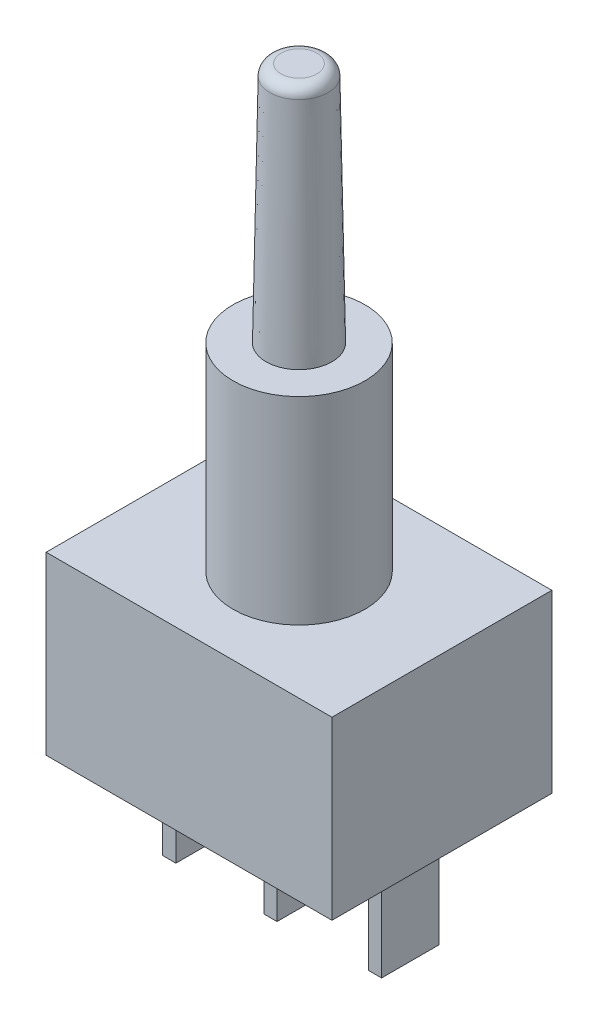
ISO-10303-21;
HEADER;
FILE_DESCRIPTION(('STEP AP214'),'2;1');
FILE_NAME('part.step','',(''),(''),'','','');
FILE_SCHEMA(('AUTOMOTIVE_DESIGN { 1 0 10303 214 1 1 1 1 }'));
ENDSEC;
DATA;
#1=APPLICATION_CONTEXT('core data for automotive mechanical design processes');
#2=APPLICATION_PROTOCOL_DEFINITION('international standard','automotive_design',2000,#1);
#3=PRODUCT_CONTEXT('',#1,'mechanical');
#4=PRODUCT('Part','Part','',(#3));
#5=PRODUCT_RELATED_PRODUCT_CATEGORY('part','',(#4));
#6=PRODUCT_DEFINITION_FORMATION('','',#4);
#7=PRODUCT_DEFINITION_CONTEXT('part definition',#1,'design');
#8=PRODUCT_DEFINITION('design','',#6,#7);
#9=PRODUCT_DEFINITION_SHAPE('','',#8);
#10=(LENGTH_UNIT() NAMED_UNIT(*) SI_UNIT(.MILLI.,.METRE.));
#11=(NAMED_UNIT(*) PLANE_ANGLE_UNIT() SI_UNIT($,.RADIAN.));
#12=(NAMED_UNIT(*) SI_UNIT($,.STERADIAN.) SOLID_ANGLE_UNIT());
#13=UNCERTAINTY_MEASURE_WITH_UNIT(LENGTH_MEASURE(1.E-05),#10,'distance_accuracy_value','');
#14=(GEOMETRIC_REPRESENTATION_CONTEXT(3) GLOBAL_UNCERTAINTY_ASSIGNED_CONTEXT((#13)) GLOBAL_UNIT_ASSIGNED_CONTEXT((#10,
#11,#12)) REPRESENTATION_CONTEXT('',''));
#15=CARTESIAN_POINT('',(0.,0.,0.));
#16=DIRECTION('',(0.,0.,1.));
#17=DIRECTION('',(1.,0.,0.));
#18=AXIS2_PLACEMENT_3D('',#15,#16,#17);
#19=CARTESIAN_POINT('',(0.,0.,0.));
#20=DIRECTION('',(0.,1.,0.));
#21=DIRECTION('',(0.,0.,1.));
#22=AXIS2_PLACEMENT_3D('',#19,#20,#21);
#23=PLANE('',#22);
#24=DIRECTION('',(0.,0.,1.));
#25=VECTOR('',#24,1.);
#26=CARTESIAN_POINT('',(0.3,0.,1.3));
#27=LINE('',#26,#25);
#28=CARTESIAN_POINT('',(0.3,0.,-1.3));
#29=VERTEX_POINT('',#28);
#30=CARTESIAN_POINT('',(0.3,0.,1.3));
#31=VERTEX_POINT('',#30);
#32=EDGE_CURVE('E173',#29,#31,#27,.T.);
#33=ORIENTED_EDGE('',*,*,#32,.F.);
#34=DIRECTION('',(1.,0.,0.));
#35=VECTOR('',#34,1.);
#36=CARTESIAN_POINT('',(-0.3,0.,-1.3));
#37=LINE('',#36,#35);
#38=CARTESIAN_POINT('',(-0.3,0.,-1.3));
#39=VERTEX_POINT('',#38);
#40=EDGE_CURVE('E186',#39,#29,#37,.T.);
#41=ORIENTED_EDGE('',*,*,#40,.F.);
#42=DIRECTION('',(0.,0.,-1.));
#43=VECTOR('',#42,1.);
#44=CARTESIAN_POINT('',(-0.3,0.,1.3));
#45=LINE('',#44,#43);
#46=CARTESIAN_POINT('',(-0.3,0.,1.3));
#47=VERTEX_POINT('',#46);
#48=EDGE_CURVE('E195',#47,#39,#45,.T.);
#49=ORIENTED_EDGE('',*,*,#48,.F.);
#50=DIRECTION('',(-1.,0.,0.));
#51=VECTOR('',#50,1.);
#52=CARTESIAN_POINT('',(-0.3,0.,1.3));
#53=LINE('',#52,#51);
#54=EDGE_CURVE('E176',#31,#47,#53,.T.);
#55=ORIENTED_EDGE('',*,*,#54,.F.);
#56=EDGE_LOOP('',(#33,#41,#49,#55));
#57=FACE_BOUND('',#56,.T.);
#58=DIRECTION('',(0.,0.,-1.));
#59=VECTOR('',#58,1.);
#60=CARTESIAN_POINT('',(6.5,0.,-5.));
#61=LINE('',#60,#59);
#62=CARTESIAN_POINT('',(6.5,0.,5.));
#63=VERTEX_POINT('',#62);
#64=CARTESIAN_POINT('',(6.5,0.,-5.));
#65=VERTEX_POINT('',#64);
#66=EDGE_CURVE('E251',#63,#65,#61,.T.);
#67=ORIENTED_EDGE('',*,*,#66,.F.);
#68=DIRECTION('',(1.,0.,0.));
#69=VECTOR('',#68,1.);
#70=CARTESIAN_POINT('',(-6.5,0.,5.));
#71=LINE('',#70,#69);
#72=CARTESIAN_POINT('',(-6.5,0.,5.));
#73=VERTEX_POINT('',#72);
#74=EDGE_CURVE('E259',#73,#63,#71,.T.);
#75=ORIENTED_EDGE('',*,*,#74,.F.);
#76=DIRECTION('',(0.,0.,1.));
#77=VECTOR('',#76,1.);
#78=CARTESIAN_POINT('',(-6.5,0.,-5.));
#79=LINE('',#78,#77);
#80=CARTESIAN_POINT('',(-6.5,0.,-5.));
#81=VERTEX_POINT('',#80);
#82=EDGE_CURVE('E270',#81,#73,#79,.T.);
#83=ORIENTED_EDGE('',*,*,#82,.F.);
#84=DIRECTION('',(-1.,0.,0.));
#85=VECTOR('',#84,1.);
#86=CARTESIAN_POINT('',(-6.5,0.,-5.));
#87=LINE('',#86,#85);
#88=EDGE_CURVE('E268',#65,#81,#87,.T.);
#89=ORIENTED_EDGE('',*,*,#88,.F.);
#90=EDGE_LOOP('',(#67,#75,#83,#89));
#91=FACE_BOUND('',#90,.T.);
#92=DIRECTION('',(0.,0.,1.));
#93=VECTOR('',#92,1.);
#94=CARTESIAN_POINT('',(-4.3,0.,1.3));
#95=LINE('',#94,#93);
#96=CARTESIAN_POINT('',(-4.3,0.,-1.3));
#97=VERTEX_POINT('',#96);
#98=CARTESIAN_POINT('',(-4.3,0.,1.3));
#99=VERTEX_POINT('',#98);
#100=EDGE_CURVE('E211',#97,#99,#95,.T.);
#101=ORIENTED_EDGE('',*,*,#100,.F.);
#102=DIRECTION('',(1.,0.,0.));
#103=VECTOR('',#102,1.);
#104=CARTESIAN_POINT('',(-4.9,0.,-1.3));
#105=LINE('',#104,#103);
#106=CARTESIAN_POINT('',(-4.9,0.,-1.3));
#107=VERTEX_POINT('',#106);
#108=EDGE_CURVE('E216',#107,#97,#105,.T.);
#109=ORIENTED_EDGE('',*,*,#108,.F.);
#110=DIRECTION('',(0.,0.,-1.));
#111=VECTOR('',#110,1.);
#112=CARTESIAN_POINT('',(-4.9,0.,1.3));
#113=LINE('',#112,#111);
#114=CARTESIAN_POINT('',(-4.9,0.,1.3));
#115=VERTEX_POINT('',#114);
#116=EDGE_CURVE('E228',#115,#107,#113,.T.);
#117=ORIENTED_EDGE('',*,*,#116,.F.);
#118=DIRECTION('',(-1.,0.,0.));
#119=VECTOR('',#118,1.);
#120=CARTESIAN_POINT('',(-4.9,0.,1.3));
#121=LINE('',#120,#119);
#122=EDGE_CURVE('E225',#99,#115,#121,.T.);
#123=ORIENTED_EDGE('',*,*,#122,.F.);
#124=EDGE_LOOP('',(#101,#109,#117,#123));
#125=FACE_BOUND('',#124,.T.);
#126=DIRECTION('',(0.,0.,1.));
#127=VECTOR('',#126,1.);
#128=CARTESIAN_POINT('',(4.9,0.,1.14348945082824));
#129=LINE('',#128,#127);
#130=CARTESIAN_POINT('',(4.9,0.,-1.45651054917176));
#131=VERTEX_POINT('',#130);
#132=CARTESIAN_POINT('',(4.9,0.,1.14348945082824));
#133=VERTEX_POINT('',#132);
#134=EDGE_CURVE('E172',#131,#133,#129,.T.);
#135=ORIENTED_EDGE('',*,*,#134,.F.);
#136=DIRECTION('',(1.,0.,0.));
#137=VECTOR('',#136,1.);
#138=CARTESIAN_POINT('',(4.3,0.,-1.45651054917176));
#139=LINE('',#138,#137);
#140=CARTESIAN_POINT('',(4.3,0.,-1.45651054917176));
#141=VERTEX_POINT('',#140);
#142=EDGE_CURVE('E169',#141,#131,#139,.T.);
#143=ORIENTED_EDGE('',*,*,#142,.F.);
#144=DIRECTION('',(0.,0.,-1.));
#145=VECTOR('',#144,1.);
#146=CARTESIAN_POINT('',(4.3,0.,1.14348945082824));
#147=LINE('',#146,#145);
#148=CARTESIAN_POINT('',(4.3,0.,1.14348945082824));
#149=VERTEX_POINT('',#148);
#150=EDGE_CURVE('E59',#149,#141,#147,.T.);
#151=ORIENTED_EDGE('',*,*,#150,.F.);
#152=DIRECTION('',(-1.,0.,0.));
#153=VECTOR('',#152,1.);
#154=CARTESIAN_POINT('',(4.3,0.,1.14348945082824));
#155=LINE('',#154,#153);
#156=EDGE_CURVE('E54',#133,#149,#155,.T.);
#157=ORIENTED_EDGE('',*,*,#156,.F.);
#158=EDGE_LOOP('',(#135,#143,#151,#157));
#159=FACE_BOUND('',#158,.T.);
#160=ADVANCED_FACE('F39',(#57,#91,#125,#159),#23,.F.);
#161=CARTESIAN_POINT('',(6.5,8.,-5.));
#162=DIRECTION('',(-1.,0.,0.));
#163=DIRECTION('',(0.,0.,1.));
#164=AXIS2_PLACEMENT_3D('',#161,#162,#163);
#165=PLANE('',#164);
#166=ORIENTED_EDGE('',*,*,#66,.T.);
#167=DIRECTION('',(0.,-1.,0.));
#168=VECTOR('',#167,1.);
#169=CARTESIAN_POINT('',(6.5,8.,-5.));
#170=LINE('',#169,#168);
#171=CARTESIAN_POINT('',(6.5,8.,-5.));
#172=VERTEX_POINT('',#171);
#173=EDGE_CURVE('E254',#172,#65,#170,.T.);
#174=ORIENTED_EDGE('',*,*,#173,.F.);
#175=DIRECTION('',(0.,0.,-1.));
#176=VECTOR('',#175,1.);
#177=CARTESIAN_POINT('',(6.5,8.,-5.));
#178=LINE('',#177,#176);
#179=CARTESIAN_POINT('',(6.5,8.,5.));
#180=VERTEX_POINT('',#179);
#181=EDGE_CURVE('E255',#180,#172,#178,.T.);
#182=ORIENTED_EDGE('',*,*,#181,.F.);
#183=DIRECTION('',(0.,-1.,0.));
#184=VECTOR('',#183,1.);
#185=CARTESIAN_POINT('',(6.5,8.,5.));
#186=LINE('',#185,#184);
#187=EDGE_CURVE('E265',#180,#63,#186,.T.);
#188=ORIENTED_EDGE('',*,*,#187,.T.);
#189=EDGE_LOOP('',(#166,#174,#182,#188));
#190=FACE_BOUND('',#189,.T.);
#191=ADVANCED_FACE('F301',(#190),#165,.F.);
#192=CARTESIAN_POINT('',(-6.5,8.,-5.));
#193=DIRECTION('',(0.,0.,1.));
#194=DIRECTION('',(1.,0.,0.));
#195=AXIS2_PLACEMENT_3D('',#192,#193,#194);
#196=PLANE('',#195);
#197=ORIENTED_EDGE('',*,*,#88,.T.);
#198=DIRECTION('',(0.,-1.,0.));
#199=VECTOR('',#198,1.);
#200=CARTESIAN_POINT('',(-6.5,8.,-5.));
#201=LINE('',#200,#199);
#202=CARTESIAN_POINT('',(-6.5,8.,-5.));
#203=VERTEX_POINT('',#202);
#204=EDGE_CURVE('E278',#203,#81,#201,.T.);
#205=ORIENTED_EDGE('',*,*,#204,.F.);
#206=DIRECTION('',(-1.,0.,0.));
#207=VECTOR('',#206,1.);
#208=CARTESIAN_POINT('',(-6.5,8.,-5.));
#209=LINE('',#208,#207);
#210=EDGE_CURVE('E258',#172,#203,#209,.T.);
#211=ORIENTED_EDGE('',*,*,#210,.F.);
#212=ORIENTED_EDGE('',*,*,#173,.T.);
#213=EDGE_LOOP('',(#197,#205,#211,#212));
#214=FACE_BOUND('',#213,.T.);
#215=ADVANCED_FACE('F307',(#214),#196,.F.);
#216=CARTESIAN_POINT('',(-6.5,8.,-5.));
#217=DIRECTION('',(1.,0.,0.));
#218=DIRECTION('',(0.,0.,-1.));
#219=AXIS2_PLACEMENT_3D('',#216,#217,#218);
#220=PLANE('',#219);
#221=ORIENTED_EDGE('',*,*,#82,.T.);
#222=DIRECTION('',(0.,-1.,0.));
#223=VECTOR('',#222,1.);
#224=CARTESIAN_POINT('',(-6.5,8.,5.));
#225=LINE('',#224,#223);
#226=CARTESIAN_POINT('',(-6.5,8.,5.));
#227=VERTEX_POINT('',#226);
#228=EDGE_CURVE('E275',#227,#73,#225,.T.);
#229=ORIENTED_EDGE('',*,*,#228,.F.);
#230=DIRECTION('',(0.,0.,1.));
#231=VECTOR('',#230,1.);
#232=CARTESIAN_POINT('',(-6.5,8.,-5.));
#233=LINE('',#232,#231);
#234=EDGE_CURVE('E261',#203,#227,#233,.T.);
#235=ORIENTED_EDGE('',*,*,#234,.F.);
#236=ORIENTED_EDGE('',*,*,#204,.T.);
#237=EDGE_LOOP('',(#221,#229,#235,#236));
#238=FACE_BOUND('',#237,.T.);
#239=ADVANCED_FACE('F317',(#238),#220,.F.);
#240=CARTESIAN_POINT('',(-6.5,8.,5.));
#241=DIRECTION('',(0.,0.,-1.));
#242=DIRECTION('',(-1.,0.,0.));
#243=AXIS2_PLACEMENT_3D('',#240,#241,#242);
#244=PLANE('',#243);
#245=ORIENTED_EDGE('',*,*,#74,.T.);
#246=ORIENTED_EDGE('',*,*,#187,.F.);
#247=DIRECTION('',(1.,0.,0.));
#248=VECTOR('',#247,1.);
#249=CARTESIAN_POINT('',(-6.5,8.,5.));
#250=LINE('',#249,#248);
#251=EDGE_CURVE('E263',#227,#180,#250,.T.);
#252=ORIENTED_EDGE('',*,*,#251,.F.);
#253=ORIENTED_EDGE('',*,*,#228,.T.);
#254=EDGE_LOOP('',(#245,#246,#252,#253));
#255=FACE_BOUND('',#254,.T.);
#256=ADVANCED_FACE('F314',(#255),#244,.F.);
#257=CARTESIAN_POINT('',(0.,8.,0.));
#258=DIRECTION('',(0.,1.,0.));
#259=DIRECTION('',(0.,0.,1.));
#260=AXIS2_PLACEMENT_3D('',#257,#258,#259);
#261=PLANE('',#260);
#262=CARTESIAN_POINT('',(0.,8.,0.));
#263=DIRECTION('',(0.,1.,0.));
#264=DIRECTION('',(0.,0.,1.));
#265=AXIS2_PLACEMENT_3D('',#262,#263,#264);
#266=CIRCLE('',#265,3.);
#267=CARTESIAN_POINT('',(0.,8.,3.));
#268=VERTEX_POINT('',#267);
#269=EDGE_CURVE('E248',#268,#268,#266,.T.);
#270=ORIENTED_EDGE('',*,*,#269,.F.);
#271=EDGE_LOOP('',(#270));
#272=FACE_BOUND('',#271,.T.);
#273=ORIENTED_EDGE('',*,*,#181,.T.);
#274=ORIENTED_EDGE('',*,*,#210,.T.);
#275=ORIENTED_EDGE('',*,*,#234,.T.);
#276=ORIENTED_EDGE('',*,*,#251,.T.);
#277=EDGE_LOOP('',(#273,#274,#275,#276));
#278=FACE_BOUND('',#277,.T.);
#279=ADVANCED_FACE('F312',(#272,#278),#261,.T.);
#280=CARTESIAN_POINT('',(0.,17.,0.));
#281=DIRECTION('',(0.,-1.,0.));
#282=DIRECTION('',(0.,0.,-1.));
#283=AXIS2_PLACEMENT_3D('',#280,#281,#282);
#284=CYLINDRICAL_SURFACE('',#283,3.);
#285=CARTESIAN_POINT('',(0.,17.,0.));
#286=DIRECTION('',(0.,1.,0.));
#287=DIRECTION('',(0.,0.,1.));
#288=AXIS2_PLACEMENT_3D('',#285,#286,#287);
#289=CIRCLE('',#288,3.);
#290=CARTESIAN_POINT('',(0.,17.,3.));
#291=VERTEX_POINT('',#290);
#292=EDGE_CURVE('E244',#291,#291,#289,.T.);
#293=ORIENTED_EDGE('',*,*,#292,.F.);
#294=EDGE_LOOP('',(#293));
#295=FACE_BOUND('',#294,.T.);
#296=ORIENTED_EDGE('',*,*,#269,.T.);
#297=EDGE_LOOP('',(#296));
#298=FACE_BOUND('',#297,.T.);
#299=ADVANCED_FACE('F339',(#295,#298),#284,.T.);
#300=CARTESIAN_POINT('',(0.,17.,0.));
#301=DIRECTION('',(0.,1.,0.));
#302=DIRECTION('',(0.,0.,1.));
#303=AXIS2_PLACEMENT_3D('',#300,#301,#302);
#304=PLANE('',#303);
#305=CARTESIAN_POINT('',(0.,17.,0.));
#306=DIRECTION('',(0.,1.,0.));
#307=DIRECTION('',(0.,0.,1.));
#308=AXIS2_PLACEMENT_3D('',#305,#306,#307);
#309=CIRCLE('',#308,1.5);
#310=CARTESIAN_POINT('',(0.,17.,1.5));
#311=VERTEX_POINT('',#310);
#312=EDGE_CURVE('E245',#311,#311,#309,.T.);
#313=ORIENTED_EDGE('',*,*,#312,.F.);
#314=EDGE_LOOP('',(#313));
#315=FACE_BOUND('',#314,.T.);
#316=ORIENTED_EDGE('',*,*,#292,.T.);
#317=EDGE_LOOP('',(#316));
#318=FACE_BOUND('',#317,.T.);
#319=ADVANCED_FACE('F344',(#315,#318),#304,.T.);
#320=CARTESIAN_POINT('',(0.,17.,0.));
#321=DIRECTION('',(0.,-1.,0.));
#322=DIRECTION('',(0.,0.,1.));
#323=AXIS2_PLACEMENT_3D('',#320,#321,#322);
#324=CONICAL_SURFACE('',#323,1.5,0.0174532925199433);
#325=CARTESIAN_POINT('',(0.,27.5087262032186,0.));
#326=DIRECTION('',(0.,-1.,0.));
#327=DIRECTION('',(0.,0.,-1.));
#328=AXIS2_PLACEMENT_3D('',#325,#326,#327);
#329=CIRCLE('',#328,1.31656950180996);
#330=CARTESIAN_POINT('',(0.,27.5087262032186,-1.31656950180996));
#331=VERTEX_POINT('',#330);
#332=EDGE_CURVE('E11',#331,#331,#329,.T.);
#333=ORIENTED_EDGE('',*,*,#332,.T.);
#334=EDGE_LOOP('',(#333));
#335=FACE_BOUND('',#334,.T.);
#336=ORIENTED_EDGE('',*,*,#312,.T.);
#337=EDGE_LOOP('',(#336));
#338=FACE_BOUND('',#337,.T.);
#339=ADVANCED_FACE('F297',(#335,#338),#324,.T.);
#340=CARTESIAN_POINT('',(0.,28.,0.));
#341=DIRECTION('',(0.,1.,0.));
#342=DIRECTION('',(0.,0.,1.));
#343=AXIS2_PLACEMENT_3D('',#340,#341,#342);
#344=PLANE('',#343);
#345=CARTESIAN_POINT('',(0.,28.,0.));
#346=DIRECTION('',(0.,1.,0.));
#347=DIRECTION('',(0.,0.,1.));
#348=AXIS2_PLACEMENT_3D('',#345,#346,#347);
#349=CIRCLE('',#348,0.816645654231762);
#350=CARTESIAN_POINT('',(0.,28.,0.816645654231762));
#351=VERTEX_POINT('',#350);
#352=EDGE_CURVE('E47',#351,#351,#349,.T.);
#353=ORIENTED_EDGE('',*,*,#352,.T.);
#354=EDGE_LOOP('',(#353));
#355=FACE_BOUND('',#354,.T.);
#356=ADVANCED_FACE('F285',(#355),#344,.T.);
#357=CARTESIAN_POINT('',(0.,27.5,0.));
#358=DIRECTION('',(0.,1.,0.));
#359=DIRECTION('',(0.,0.,1.));
#360=AXIS2_PLACEMENT_3D('',#357,#358,#359);
#361=TOROIDAL_SURFACE('',#360,0.816645654231762,0.5);
#362=ORIENTED_EDGE('',*,*,#332,.F.);
#363=EDGE_LOOP('',(#362));
#364=FACE_BOUND('',#363,.T.);
#365=ORIENTED_EDGE('',*,*,#352,.F.);
#366=EDGE_LOOP('',(#365));
#367=FACE_BOUND('',#366,.T.);
#368=ADVANCED_FACE('F41',(#364,#367),#361,.T.);
#369=CARTESIAN_POINT('',(-4.3,-5.,1.3));
#370=DIRECTION('',(-1.,0.,0.));
#371=DIRECTION('',(0.,0.,1.));
#372=AXIS2_PLACEMENT_3D('',#369,#370,#371);
#373=PLANE('',#372);
#374=ORIENTED_EDGE('',*,*,#100,.T.);
#375=DIRECTION('',(0.,1.,0.));
#376=VECTOR('',#375,1.);
#377=CARTESIAN_POINT('',(-4.3,-5.,1.3));
#378=LINE('',#377,#376);
#379=CARTESIAN_POINT('',(-4.3,-5.,1.3));
#380=VERTEX_POINT('',#379);
#381=EDGE_CURVE('E241',#380,#99,#378,.T.);
#382=ORIENTED_EDGE('',*,*,#381,.F.);
#383=DIRECTION('',(0.,0.,1.));
#384=VECTOR('',#383,1.);
#385=CARTESIAN_POINT('',(-4.3,-5.,1.3));
#386=LINE('',#385,#384);
#387=CARTESIAN_POINT('',(-4.3,-5.,-1.3));
#388=VERTEX_POINT('',#387);
#389=EDGE_CURVE('E212',#388,#380,#386,.T.);
#390=ORIENTED_EDGE('',*,*,#389,.F.);
#391=DIRECTION('',(0.,1.,0.));
#392=VECTOR('',#391,1.);
#393=CARTESIAN_POINT('',(-4.3,-5.,-1.3));
#394=LINE('',#393,#392);
#395=EDGE_CURVE('E222',#388,#97,#394,.T.);
#396=ORIENTED_EDGE('',*,*,#395,.T.);
#397=EDGE_LOOP('',(#374,#382,#390,#396));
#398=FACE_BOUND('',#397,.T.);
#399=ADVANCED_FACE('F288',(#398),#373,.F.);
#400=CARTESIAN_POINT('',(-4.9,-5.,1.3));
#401=DIRECTION('',(0.,0.,-1.));
#402=DIRECTION('',(-1.,0.,0.));
#403=AXIS2_PLACEMENT_3D('',#400,#401,#402);
#404=PLANE('',#403);
#405=ORIENTED_EDGE('',*,*,#122,.T.);
#406=DIRECTION('',(0.,1.,0.));
#407=VECTOR('',#406,1.);
#408=CARTESIAN_POINT('',(-4.9,-5.,1.3));
#409=LINE('',#408,#407);
#410=CARTESIAN_POINT('',(-4.9,-5.,1.3));
#411=VERTEX_POINT('',#410);
#412=EDGE_CURVE('E238',#411,#115,#409,.T.);
#413=ORIENTED_EDGE('',*,*,#412,.F.);
#414=DIRECTION('',(-1.,0.,0.));
#415=VECTOR('',#414,1.);
#416=CARTESIAN_POINT('',(-4.9,-5.,1.3));
#417=LINE('',#416,#415);
#418=EDGE_CURVE('E215',#380,#411,#417,.T.);
#419=ORIENTED_EDGE('',*,*,#418,.F.);
#420=ORIENTED_EDGE('',*,*,#381,.T.);
#421=EDGE_LOOP('',(#405,#413,#419,#420));
#422=FACE_BOUND('',#421,.T.);
#423=ADVANCED_FACE('F294',(#422),#404,.F.);
#424=CARTESIAN_POINT('',(-4.9,-5.,1.3));
#425=DIRECTION('',(1.,0.,0.));
#426=DIRECTION('',(0.,0.,-1.));
#427=AXIS2_PLACEMENT_3D('',#424,#425,#426);
#428=PLANE('',#427);
#429=ORIENTED_EDGE('',*,*,#116,.T.);
#430=DIRECTION('',(0.,1.,0.));
#431=VECTOR('',#430,1.);
#432=CARTESIAN_POINT('',(-4.9,-5.,-1.3));
#433=LINE('',#432,#431);
#434=CARTESIAN_POINT('',(-4.9,-5.,-1.3));
#435=VERTEX_POINT('',#434);
#436=EDGE_CURVE('E235',#435,#107,#433,.T.);
#437=ORIENTED_EDGE('',*,*,#436,.F.);
#438=DIRECTION('',(0.,0.,-1.));
#439=VECTOR('',#438,1.);
#440=CARTESIAN_POINT('',(-4.9,-5.,1.3));
#441=LINE('',#440,#439);
#442=EDGE_CURVE('E218',#411,#435,#441,.T.);
#443=ORIENTED_EDGE('',*,*,#442,.F.);
#444=ORIENTED_EDGE('',*,*,#412,.T.);
#445=EDGE_LOOP('',(#429,#437,#443,#444));
#446=FACE_BOUND('',#445,.T.);
#447=ADVANCED_FACE('F360',(#446),#428,.F.);
#448=CARTESIAN_POINT('',(-4.9,-5.,-1.3));
#449=DIRECTION('',(0.,0.,1.));
#450=DIRECTION('',(1.,0.,0.));
#451=AXIS2_PLACEMENT_3D('',#448,#449,#450);
#452=PLANE('',#451);
#453=ORIENTED_EDGE('',*,*,#108,.T.);
#454=ORIENTED_EDGE('',*,*,#395,.F.);
#455=DIRECTION('',(1.,0.,0.));
#456=VECTOR('',#455,1.);
#457=CARTESIAN_POINT('',(-4.9,-5.,-1.3));
#458=LINE('',#457,#456);
#459=EDGE_CURVE('E220',#435,#388,#458,.T.);
#460=ORIENTED_EDGE('',*,*,#459,.F.);
#461=ORIENTED_EDGE('',*,*,#436,.T.);
#462=EDGE_LOOP('',(#453,#454,#460,#461));
#463=FACE_BOUND('',#462,.T.);
#464=ADVANCED_FACE('F364',(#463),#452,.F.);
#465=CARTESIAN_POINT('',(0.,-5.,0.));
#466=DIRECTION('',(0.,-1.,0.));
#467=DIRECTION('',(0.,0.,-1.));
#468=AXIS2_PLACEMENT_3D('',#465,#466,#467);
#469=PLANE('',#468);
#470=ORIENTED_EDGE('',*,*,#389,.T.);
#471=ORIENTED_EDGE('',*,*,#418,.T.);
#472=ORIENTED_EDGE('',*,*,#442,.T.);
#473=ORIENTED_EDGE('',*,*,#459,.T.);
#474=EDGE_LOOP('',(#470,#471,#472,#473));
#475=FACE_BOUND('',#474,.T.);
#476=ADVANCED_FACE('F368',(#475),#469,.T.);
#477=CARTESIAN_POINT('',(0.3,-5.,1.3));
#478=DIRECTION('',(-1.,0.,0.));
#479=DIRECTION('',(0.,0.,1.));
#480=AXIS2_PLACEMENT_3D('',#477,#478,#479);
#481=PLANE('',#480);
#482=ORIENTED_EDGE('',*,*,#32,.T.);
#483=DIRECTION('',(0.,1.,0.));
#484=VECTOR('',#483,1.);
#485=CARTESIAN_POINT('',(0.3,-5.,1.3));
#486=LINE('',#485,#484);
#487=CARTESIAN_POINT('',(0.3,-5.,1.3));
#488=VERTEX_POINT('',#487);
#489=EDGE_CURVE('E208',#488,#31,#486,.T.);
#490=ORIENTED_EDGE('',*,*,#489,.F.);
#491=DIRECTION('',(0.,0.,1.));
#492=VECTOR('',#491,1.);
#493=CARTESIAN_POINT('',(0.3,-5.,1.3));
#494=LINE('',#493,#492);
#495=CARTESIAN_POINT('',(0.3,-5.,-1.3));
#496=VERTEX_POINT('',#495);
#497=EDGE_CURVE('E182',#496,#488,#494,.T.);
#498=ORIENTED_EDGE('',*,*,#497,.F.);
#499=DIRECTION('',(0.,1.,0.));
#500=VECTOR('',#499,1.);
#501=CARTESIAN_POINT('',(0.3,-5.,-1.3));
#502=LINE('',#501,#500);
#503=EDGE_CURVE('E191',#496,#29,#502,.T.);
#504=ORIENTED_EDGE('',*,*,#503,.T.);
#505=EDGE_LOOP('',(#482,#490,#498,#504));
#506=FACE_BOUND('',#505,.T.);
#507=ADVANCED_FACE('F372',(#506),#481,.F.);
#508=CARTESIAN_POINT('',(-0.3,-5.,1.3));
#509=DIRECTION('',(0.,0.,-1.));
#510=DIRECTION('',(-1.,0.,0.));
#511=AXIS2_PLACEMENT_3D('',#508,#509,#510);
#512=PLANE('',#511);
#513=ORIENTED_EDGE('',*,*,#54,.T.);
#514=DIRECTION('',(0.,1.,0.));
#515=VECTOR('',#514,1.);
#516=CARTESIAN_POINT('',(-0.3,-5.,1.3));
#517=LINE('',#516,#515);
#518=CARTESIAN_POINT('',(-0.3,-5.,1.3));
#519=VERTEX_POINT('',#518);
#520=EDGE_CURVE('E205',#519,#47,#517,.T.);
#521=ORIENTED_EDGE('',*,*,#520,.F.);
#522=DIRECTION('',(-1.,0.,0.));
#523=VECTOR('',#522,1.);
#524=CARTESIAN_POINT('',(-0.3,-5.,1.3));
#525=LINE('',#524,#523);
#526=EDGE_CURVE('E185',#488,#519,#525,.T.);
#527=ORIENTED_EDGE('',*,*,#526,.F.);
#528=ORIENTED_EDGE('',*,*,#489,.T.);
#529=EDGE_LOOP('',(#513,#521,#527,#528));
#530=FACE_BOUND('',#529,.T.);
#531=ADVANCED_FACE('F376',(#530),#512,.F.);
#532=CARTESIAN_POINT('',(-0.3,-5.,1.3));
#533=DIRECTION('',(1.,0.,0.));
#534=DIRECTION('',(0.,0.,-1.));
#535=AXIS2_PLACEMENT_3D('',#532,#533,#534);
#536=PLANE('',#535);
#537=ORIENTED_EDGE('',*,*,#48,.T.);
#538=DIRECTION('',(0.,1.,0.));
#539=VECTOR('',#538,1.);
#540=CARTESIAN_POINT('',(-0.3,-5.,-1.3));
#541=LINE('',#540,#539);
#542=CARTESIAN_POINT('',(-0.3,-5.,-1.3));
#543=VERTEX_POINT('',#542);
#544=EDGE_CURVE('E202',#543,#39,#541,.T.);
#545=ORIENTED_EDGE('',*,*,#544,.F.);
#546=DIRECTION('',(0.,0.,-1.));
#547=VECTOR('',#546,1.);
#548=CARTESIAN_POINT('',(-0.3,-5.,1.3));
#549=LINE('',#548,#547);
#550=EDGE_CURVE('E188',#519,#543,#549,.T.);
#551=ORIENTED_EDGE('',*,*,#550,.F.);
#552=ORIENTED_EDGE('',*,*,#520,.T.);
#553=EDGE_LOOP('',(#537,#545,#551,#552));
#554=FACE_BOUND('',#553,.T.);
#555=ADVANCED_FACE('F380',(#554),#536,.F.);
#556=CARTESIAN_POINT('',(-0.3,-5.,-1.3));
#557=DIRECTION('',(0.,0.,1.));
#558=DIRECTION('',(1.,0.,0.));
#559=AXIS2_PLACEMENT_3D('',#556,#557,#558);
#560=PLANE('',#559);
#561=ORIENTED_EDGE('',*,*,#40,.T.);
#562=ORIENTED_EDGE('',*,*,#503,.F.);
#563=DIRECTION('',(1.,0.,0.));
#564=VECTOR('',#563,1.);
#565=CARTESIAN_POINT('',(-0.3,-5.,-1.3));
#566=LINE('',#565,#564);
#567=EDGE_CURVE('E190',#543,#496,#566,.T.);
#568=ORIENTED_EDGE('',*,*,#567,.F.);
#569=ORIENTED_EDGE('',*,*,#544,.T.);
#570=EDGE_LOOP('',(#561,#562,#568,#569));
#571=FACE_BOUND('',#570,.T.);
#572=ADVANCED_FACE('F384',(#571),#560,.F.);
#573=CARTESIAN_POINT('',(0.,-5.,0.));
#574=DIRECTION('',(0.,-1.,0.));
#575=DIRECTION('',(0.,0.,-1.));
#576=AXIS2_PLACEMENT_3D('',#573,#574,#575);
#577=PLANE('',#576);
#578=ORIENTED_EDGE('',*,*,#497,.T.);
#579=ORIENTED_EDGE('',*,*,#526,.T.);
#580=ORIENTED_EDGE('',*,*,#550,.T.);
#581=ORIENTED_EDGE('',*,*,#567,.T.);
#582=EDGE_LOOP('',(#578,#579,#580,#581));
#583=FACE_BOUND('',#582,.T.);
#584=ADVANCED_FACE('F388',(#583),#577,.T.);
#585=CARTESIAN_POINT('',(4.9,-5.,1.14348945082824));
#586=DIRECTION('',(-1.,0.,0.));
#587=DIRECTION('',(0.,0.,1.));
#588=AXIS2_PLACEMENT_3D('',#585,#586,#587);
#589=PLANE('',#588);
#590=ORIENTED_EDGE('',*,*,#134,.T.);
#591=DIRECTION('',(0.,1.,0.));
#592=VECTOR('',#591,1.);
#593=CARTESIAN_POINT('',(4.9,-5.,1.14348945082824));
#594=LINE('',#593,#592);
#595=CARTESIAN_POINT('',(4.9,-5.,1.14348945082824));
#596=VERTEX_POINT('',#595);
#597=EDGE_CURVE('E153',#596,#133,#594,.T.);
#598=ORIENTED_EDGE('',*,*,#597,.F.);
#599=DIRECTION('',(0.,0.,1.));
#600=VECTOR('',#599,1.);
#601=CARTESIAN_POINT('',(4.9,-5.,1.14348945082824));
#602=LINE('',#601,#600);
#603=CARTESIAN_POINT('',(4.9,-5.,-1.45651054917176));
#604=VERTEX_POINT('',#603);
#605=EDGE_CURVE('E160',#604,#596,#602,.T.);
#606=ORIENTED_EDGE('',*,*,#605,.F.);
#607=DIRECTION('',(0.,1.,0.));
#608=VECTOR('',#607,1.);
#609=CARTESIAN_POINT('',(4.9,-5.,-1.45651054917176));
#610=LINE('',#609,#608);
#611=EDGE_CURVE('E562',#604,#131,#610,.T.);
#612=ORIENTED_EDGE('',*,*,#611,.T.);
#613=EDGE_LOOP('',(#590,#598,#606,#612));
#614=FACE_BOUND('',#613,.T.);
#615=ADVANCED_FACE('F171',(#614),#589,.F.);
#616=CARTESIAN_POINT('',(4.3,-5.,1.14348945082824));
#617=DIRECTION('',(0.,0.,-1.));
#618=DIRECTION('',(-1.,0.,0.));
#619=AXIS2_PLACEMENT_3D('',#616,#617,#618);
#620=PLANE('',#619);
#621=ORIENTED_EDGE('',*,*,#156,.T.);
#622=DIRECTION('',(0.,1.,0.));
#623=VECTOR('',#622,1.);
#624=CARTESIAN_POINT('',(4.3,-5.,1.14348945082824));
#625=LINE('',#624,#623);
#626=CARTESIAN_POINT('',(4.3,-5.,1.14348945082824));
#627=VERTEX_POINT('',#626);
#628=EDGE_CURVE('E156',#627,#149,#625,.T.);
#629=ORIENTED_EDGE('',*,*,#628,.F.);
#630=DIRECTION('',(-1.,0.,0.));
#631=VECTOR('',#630,1.);
#632=CARTESIAN_POINT('',(4.3,-5.,1.14348945082824));
#633=LINE('',#632,#631);
#634=EDGE_CURVE('E149',#596,#627,#633,.T.);
#635=ORIENTED_EDGE('',*,*,#634,.F.);
#636=ORIENTED_EDGE('',*,*,#597,.T.);
#637=EDGE_LOOP('',(#621,#629,#635,#636));
#638=FACE_BOUND('',#637,.T.);
#639=ADVANCED_FACE('F151',(#638),#620,.F.);
#640=CARTESIAN_POINT('',(4.3,-5.,1.14348945082824));
#641=DIRECTION('',(1.,0.,0.));
#642=DIRECTION('',(0.,0.,-1.));
#643=AXIS2_PLACEMENT_3D('',#640,#641,#642);
#644=PLANE('',#643);
#645=ORIENTED_EDGE('',*,*,#150,.T.);
#646=DIRECTION('',(0.,1.,0.));
#647=VECTOR('',#646,1.);
#648=CARTESIAN_POINT('',(4.3,-5.,-1.45651054917176));
#649=LINE('',#648,#647);
#650=CARTESIAN_POINT('',(4.3,-5.,-1.45651054917176));
#651=VERTEX_POINT('',#650);
#652=EDGE_CURVE('E178',#651,#141,#649,.T.);
#653=ORIENTED_EDGE('',*,*,#652,.F.);
#654=DIRECTION('',(0.,0.,-1.));
#655=VECTOR('',#654,1.);
#656=CARTESIAN_POINT('',(4.3,-5.,1.14348945082824));
#657=LINE('',#656,#655);
#658=EDGE_CURVE('E159',#627,#651,#657,.T.);
#659=ORIENTED_EDGE('',*,*,#658,.F.);
#660=ORIENTED_EDGE('',*,*,#628,.T.);
#661=EDGE_LOOP('',(#645,#653,#659,#660));
#662=FACE_BOUND('',#661,.T.);
#663=ADVANCED_FACE('F397',(#662),#644,.F.);
#664=CARTESIAN_POINT('',(4.3,-5.,-1.45651054917176));
#665=DIRECTION('',(0.,0.,1.));
#666=DIRECTION('',(1.,0.,0.));
#667=AXIS2_PLACEMENT_3D('',#664,#665,#666);
#668=PLANE('',#667);
#669=ORIENTED_EDGE('',*,*,#142,.T.);
#670=ORIENTED_EDGE('',*,*,#611,.F.);
#671=DIRECTION('',(1.,0.,0.));
#672=VECTOR('',#671,1.);
#673=CARTESIAN_POINT('',(4.3,-5.,-1.45651054917176));
#674=LINE('',#673,#672);
#675=EDGE_CURVE('E165',#651,#604,#674,.T.);
#676=ORIENTED_EDGE('',*,*,#675,.F.);
#677=ORIENTED_EDGE('',*,*,#652,.T.);
#678=EDGE_LOOP('',(#669,#670,#676,#677));
#679=FACE_BOUND('',#678,.T.);
#680=ADVANCED_FACE('F400',(#679),#668,.F.);
#681=CARTESIAN_POINT('',(0.,-5.,0.));
#682=DIRECTION('',(0.,-1.,0.));
#683=DIRECTION('',(0.,0.,-1.));
#684=AXIS2_PLACEMENT_3D('',#681,#682,#683);
#685=PLANE('',#684);
#686=ORIENTED_EDGE('',*,*,#605,.T.);
#687=ORIENTED_EDGE('',*,*,#634,.T.);
#688=ORIENTED_EDGE('',*,*,#658,.T.);
#689=ORIENTED_EDGE('',*,*,#675,.T.);
#690=EDGE_LOOP('',(#686,#687,#688,#689));
#691=FACE_BOUND('',#690,.T.);
#692=ADVANCED_FACE('F163',(#691),#685,.T.);
#693=CLOSED_SHELL('',(#160,#191,#215,#239,#256,#279,#299,#319,#339,#356,#368,#399,#423,#447,
#464,#476,#507,#531,#555,#572,#584,#615,#639,#663,#680,#692));
#694=MANIFOLD_SOLID_BREP('B2',#693);
#695=ADVANCED_BREP_SHAPE_REPRESENTATION('',(#18,#694),#14);
#696=SHAPE_DEFINITION_REPRESENTATION(#9,#695);
ENDSEC;
END-ISO-10303-21;
